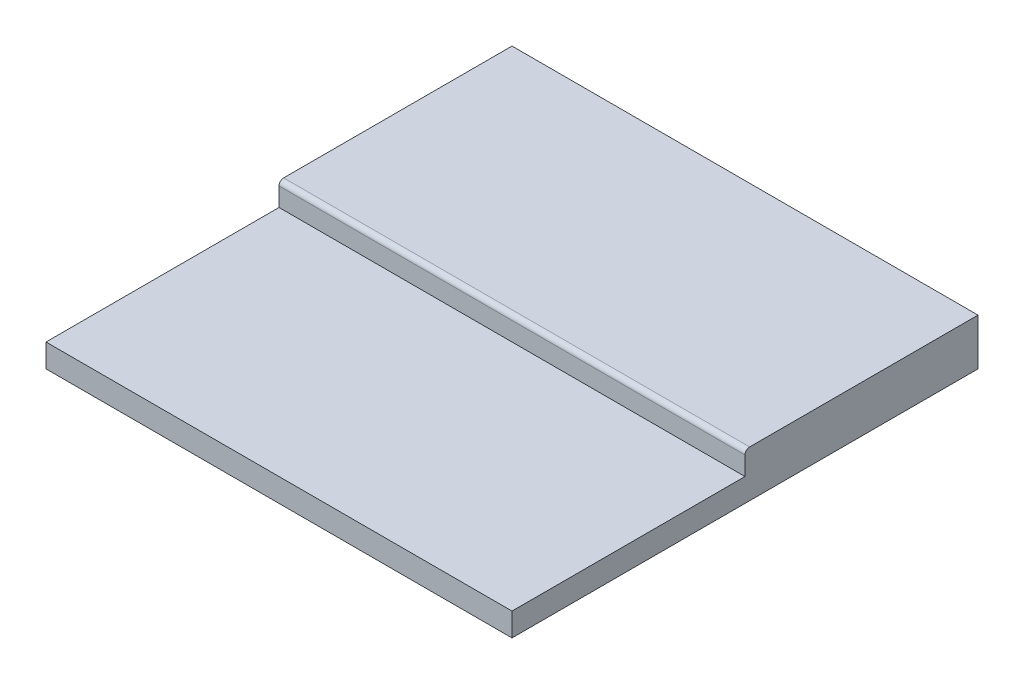
ISO-10303-21;
HEADER;
FILE_DESCRIPTION(('STEP AP214'),'2;1');
FILE_NAME('part.step','',(''),(''),'','','');
FILE_SCHEMA(('AUTOMOTIVE_DESIGN { 1 0 10303 214 1 1 1 1 }'));
ENDSEC;
DATA;
#1=APPLICATION_CONTEXT('core data for automotive mechanical design processes');
#2=APPLICATION_PROTOCOL_DEFINITION('international standard','automotive_design',2000,#1);
#3=PRODUCT_CONTEXT('',#1,'mechanical');
#4=PRODUCT('Part','Part','',(#3));
#5=PRODUCT_RELATED_PRODUCT_CATEGORY('part','',(#4));
#6=PRODUCT_DEFINITION_FORMATION('','',#4);
#7=PRODUCT_DEFINITION_CONTEXT('part definition',#1,'design');
#8=PRODUCT_DEFINITION('design','',#6,#7);
#9=PRODUCT_DEFINITION_SHAPE('','',#8);
#10=(LENGTH_UNIT() NAMED_UNIT(*) SI_UNIT(.MILLI.,.METRE.));
#11=(NAMED_UNIT(*) PLANE_ANGLE_UNIT() SI_UNIT($,.RADIAN.));
#12=(NAMED_UNIT(*) SI_UNIT($,.STERADIAN.) SOLID_ANGLE_UNIT());
#13=UNCERTAINTY_MEASURE_WITH_UNIT(LENGTH_MEASURE(1.E-05),#10,'distance_accuracy_value','');
#14=(GEOMETRIC_REPRESENTATION_CONTEXT(3) GLOBAL_UNCERTAINTY_ASSIGNED_CONTEXT((#13)) GLOBAL_UNIT_ASSIGNED_CONTEXT((#10,
#11,#12)) REPRESENTATION_CONTEXT('',''));
#15=CARTESIAN_POINT('',(0.,0.,0.));
#16=DIRECTION('',(0.,0.,1.));
#17=DIRECTION('',(1.,0.,0.));
#18=AXIS2_PLACEMENT_3D('',#15,#16,#17);
#19=CARTESIAN_POINT('',(0.,100.,0.));
#20=DIRECTION('',(0.,-1.,0.));
#21=DIRECTION('',(0.,0.,-1.));
#22=AXIS2_PLACEMENT_3D('',#19,#20,#21);
#23=PLANE('',#22);
#24=DIRECTION('',(1.,0.,0.));
#25=VECTOR('',#24,1.);
#26=CARTESIAN_POINT('',(1.22464679914735E-13,100.,-1000.));
#27=LINE('',#26,#25);
#28=CARTESIAN_POINT('',(0.,100.,-1000.));
#29=VERTEX_POINT('',#28);
#30=CARTESIAN_POINT('',(2000.,100.,-1000.));
#31=VERTEX_POINT('',#30);
#32=EDGE_CURVE('E119',#29,#31,#27,.T.);
#33=ORIENTED_EDGE('',*,*,#32,.F.);
#34=DIRECTION('',(0.,0.,1.));
#35=VECTOR('',#34,1.);
#36=CARTESIAN_POINT('',(0.,100.,0.));
#37=LINE('',#36,#35);
#38=CARTESIAN_POINT('',(0.,100.,0.));
#39=VERTEX_POINT('',#38);
#40=EDGE_CURVE('E124',#29,#39,#37,.T.);
#41=ORIENTED_EDGE('',*,*,#40,.T.);
#42=DIRECTION('',(1.,0.,0.));
#43=VECTOR('',#42,1.);
#44=CARTESIAN_POINT('',(0.,100.,0.));
#45=LINE('',#44,#43);
#46=CARTESIAN_POINT('',(2000.,100.,0.));
#47=VERTEX_POINT('',#46);
#48=EDGE_CURVE('E126',#39,#47,#45,.T.);
#49=ORIENTED_EDGE('',*,*,#48,.T.);
#50=DIRECTION('',(0.,0.,-1.));
#51=VECTOR('',#50,1.);
#52=CARTESIAN_POINT('',(2000.,100.,0.));
#53=LINE('',#52,#51);
#54=EDGE_CURVE('E129',#47,#31,#53,.T.);
#55=ORIENTED_EDGE('',*,*,#54,.T.);
#56=EDGE_LOOP('',(#33,#41,#49,#55));
#57=FACE_BOUND('',#56,.T.);
#58=ADVANCED_FACE('F32',(#57),#23,.F.);
#59=CARTESIAN_POINT('',(0.,100.,0.));
#60=DIRECTION('',(1.,0.,0.));
#61=DIRECTION('',(0.,0.,-1.));
#62=AXIS2_PLACEMENT_3D('',#59,#60,#61);
#63=PLANE('',#62);
#64=DIRECTION('',(0.,-1.,0.));
#65=VECTOR('',#64,1.);
#66=CARTESIAN_POINT('',(1.22464679914735E-13,200.,-1000.));
#67=LINE('',#66,#65);
#68=CARTESIAN_POINT('',(1.22464679914735E-13,180.,-1000.));
#69=VERTEX_POINT('',#68);
#70=EDGE_CURVE('E115',#69,#29,#67,.T.);
#71=ORIENTED_EDGE('',*,*,#70,.F.);
#72=CARTESIAN_POINT('',(0.,180.,-1020.));
#73=DIRECTION('',(1.,0.,0.));
#74=DIRECTION('',(0.,0.,-1.));
#75=AXIS2_PLACEMENT_3D('',#72,#73,#74);
#76=CIRCLE('',#75,20.);
#77=CARTESIAN_POINT('',(1.20015386316441E-13,200.,-1020.));
#78=VERTEX_POINT('',#77);
#79=EDGE_CURVE('E11',#69,#78,#76,.F.);
#80=ORIENTED_EDGE('',*,*,#79,.T.);
#81=DIRECTION('',(0.,0.,1.));
#82=VECTOR('',#81,1.);
#83=CARTESIAN_POINT('',(0.,200.,-2000.));
#84=LINE('',#83,#82);
#85=CARTESIAN_POINT('',(0.,200.,-2000.));
#86=VERTEX_POINT('',#85);
#87=EDGE_CURVE('E98',#86,#78,#84,.T.);
#88=ORIENTED_EDGE('',*,*,#87,.F.);
#89=DIRECTION('',(0.,-1.,0.));
#90=VECTOR('',#89,1.);
#91=CARTESIAN_POINT('',(0.,100.,-2000.));
#92=LINE('',#91,#90);
#93=CARTESIAN_POINT('',(0.,0.,-2000.));
#94=VERTEX_POINT('',#93);
#95=EDGE_CURVE('E109',#86,#94,#92,.T.);
#96=ORIENTED_EDGE('',*,*,#95,.T.);
#97=DIRECTION('',(0.,0.,1.));
#98=VECTOR('',#97,1.);
#99=CARTESIAN_POINT('',(0.,0.,0.));
#100=LINE('',#99,#98);
#101=CARTESIAN_POINT('',(0.,0.,0.));
#102=VERTEX_POINT('',#101);
#103=EDGE_CURVE('E123',#94,#102,#100,.T.);
#104=ORIENTED_EDGE('',*,*,#103,.T.);
#105=DIRECTION('',(0.,-1.,0.));
#106=VECTOR('',#105,1.);
#107=CARTESIAN_POINT('',(0.,100.,0.));
#108=LINE('',#107,#106);
#109=EDGE_CURVE('E140',#39,#102,#108,.T.);
#110=ORIENTED_EDGE('',*,*,#109,.F.);
#111=ORIENTED_EDGE('',*,*,#40,.F.);
#112=EDGE_LOOP('',(#71,#80,#88,#96,#104,#110,#111));
#113=FACE_BOUND('',#112,.T.);
#114=ADVANCED_FACE('F152',(#113),#63,.F.);
#115=CARTESIAN_POINT('',(0.,100.,0.));
#116=DIRECTION('',(0.,0.,-1.));
#117=DIRECTION('',(-1.,0.,0.));
#118=AXIS2_PLACEMENT_3D('',#115,#116,#117);
#119=PLANE('',#118);
#120=DIRECTION('',(1.,0.,0.));
#121=VECTOR('',#120,1.);
#122=CARTESIAN_POINT('',(0.,0.,0.));
#123=LINE('',#122,#121);
#124=CARTESIAN_POINT('',(2000.,0.,0.));
#125=VERTEX_POINT('',#124);
#126=EDGE_CURVE('E134',#102,#125,#123,.T.);
#127=ORIENTED_EDGE('',*,*,#126,.T.);
#128=DIRECTION('',(0.,-1.,0.));
#129=VECTOR('',#128,1.);
#130=CARTESIAN_POINT('',(2000.,100.,0.));
#131=LINE('',#130,#129);
#132=EDGE_CURVE('E108',#47,#125,#131,.T.);
#133=ORIENTED_EDGE('',*,*,#132,.F.);
#134=ORIENTED_EDGE('',*,*,#48,.F.);
#135=ORIENTED_EDGE('',*,*,#109,.T.);
#136=EDGE_LOOP('',(#127,#133,#134,#135));
#137=FACE_BOUND('',#136,.T.);
#138=ADVANCED_FACE('F147',(#137),#119,.F.);
#139=CARTESIAN_POINT('',(2000.,100.,0.));
#140=DIRECTION('',(-1.,0.,0.));
#141=DIRECTION('',(0.,0.,1.));
#142=AXIS2_PLACEMENT_3D('',#139,#140,#141);
#143=PLANE('',#142);
#144=DIRECTION('',(0.,0.,-1.));
#145=VECTOR('',#144,1.);
#146=CARTESIAN_POINT('',(2000.,200.,-2000.));
#147=LINE('',#146,#145);
#148=CARTESIAN_POINT('',(2000.,200.,-1020.));
#149=VERTEX_POINT('',#148);
#150=CARTESIAN_POINT('',(2000.,200.,-2000.));
#151=VERTEX_POINT('',#150);
#152=EDGE_CURVE('E89',#149,#151,#147,.T.);
#153=ORIENTED_EDGE('',*,*,#152,.F.);
#154=CARTESIAN_POINT('',(2000.,180.,-1020.));
#155=DIRECTION('',(-1.,0.,0.));
#156=DIRECTION('',(0.,0.,1.));
#157=AXIS2_PLACEMENT_3D('',#154,#155,#156);
#158=CIRCLE('',#157,20.);
#159=CARTESIAN_POINT('',(2000.,180.,-1000.));
#160=VERTEX_POINT('',#159);
#161=EDGE_CURVE('E54',#149,#160,#158,.F.);
#162=ORIENTED_EDGE('',*,*,#161,.T.);
#163=DIRECTION('',(0.,-1.,0.));
#164=VECTOR('',#163,1.);
#165=CARTESIAN_POINT('',(2000.,200.,-1000.));
#166=LINE('',#165,#164);
#167=EDGE_CURVE('E113',#160,#31,#166,.T.);
#168=ORIENTED_EDGE('',*,*,#167,.T.);
#169=ORIENTED_EDGE('',*,*,#54,.F.);
#170=ORIENTED_EDGE('',*,*,#132,.T.);
#171=DIRECTION('',(0.,0.,-1.));
#172=VECTOR('',#171,1.);
#173=CARTESIAN_POINT('',(2000.,0.,0.));
#174=LINE('',#173,#172);
#175=CARTESIAN_POINT('',(2000.,0.,-2000.));
#176=VERTEX_POINT('',#175);
#177=EDGE_CURVE('E105',#125,#176,#174,.T.);
#178=ORIENTED_EDGE('',*,*,#177,.T.);
#179=DIRECTION('',(0.,-1.,0.));
#180=VECTOR('',#179,1.);
#181=CARTESIAN_POINT('',(2000.,100.,-2000.));
#182=LINE('',#181,#180);
#183=EDGE_CURVE('E101',#151,#176,#182,.T.);
#184=ORIENTED_EDGE('',*,*,#183,.F.);
#185=EDGE_LOOP('',(#153,#162,#168,#169,#170,#178,#184));
#186=FACE_BOUND('',#185,.T.);
#187=ADVANCED_FACE('F102',(#186),#143,.F.);
#188=CARTESIAN_POINT('',(0.,100.,-2000.));
#189=DIRECTION('',(0.,0.,1.));
#190=DIRECTION('',(1.,0.,0.));
#191=AXIS2_PLACEMENT_3D('',#188,#189,#190);
#192=PLANE('',#191);
#193=DIRECTION('',(-1.,0.,0.));
#194=VECTOR('',#193,1.);
#195=CARTESIAN_POINT('',(0.,0.,-2000.));
#196=LINE('',#195,#194);
#197=EDGE_CURVE('E127',#176,#94,#196,.T.);
#198=ORIENTED_EDGE('',*,*,#197,.T.);
#199=ORIENTED_EDGE('',*,*,#95,.F.);
#200=DIRECTION('',(-1.,0.,0.));
#201=VECTOR('',#200,1.);
#202=CARTESIAN_POINT('',(0.,200.,-2000.));
#203=LINE('',#202,#201);
#204=EDGE_CURVE('E94',#151,#86,#203,.T.);
#205=ORIENTED_EDGE('',*,*,#204,.F.);
#206=ORIENTED_EDGE('',*,*,#183,.T.);
#207=EDGE_LOOP('',(#198,#199,#205,#206));
#208=FACE_BOUND('',#207,.T.);
#209=ADVANCED_FACE('F111',(#208),#192,.F.);
#210=CARTESIAN_POINT('',(0.,0.,0.));
#211=DIRECTION('',(0.,-1.,0.));
#212=DIRECTION('',(0.,0.,-1.));
#213=AXIS2_PLACEMENT_3D('',#210,#211,#212);
#214=PLANE('',#213);
#215=ORIENTED_EDGE('',*,*,#103,.F.);
#216=ORIENTED_EDGE('',*,*,#197,.F.);
#217=ORIENTED_EDGE('',*,*,#177,.F.);
#218=ORIENTED_EDGE('',*,*,#126,.F.);
#219=EDGE_LOOP('',(#215,#216,#217,#218));
#220=FACE_BOUND('',#219,.T.);
#221=ADVANCED_FACE('F154',(#220),#214,.T.);
#222=CARTESIAN_POINT('',(1.22464679914735E-13,200.,-1000.));
#223=DIRECTION('',(0.,0.,-1.));
#224=DIRECTION('',(-1.,0.,0.));
#225=AXIS2_PLACEMENT_3D('',#222,#223,#224);
#226=PLANE('',#225);
#227=ORIENTED_EDGE('',*,*,#167,.F.);
#228=DIRECTION('',(1.,0.,0.));
#229=VECTOR('',#228,1.);
#230=CARTESIAN_POINT('',(1.22464679914735E-13,180.,-1000.));
#231=LINE('',#230,#229);
#232=EDGE_CURVE('E40',#160,#69,#231,.F.);
#233=ORIENTED_EDGE('',*,*,#232,.T.);
#234=ORIENTED_EDGE('',*,*,#70,.T.);
#235=ORIENTED_EDGE('',*,*,#32,.T.);
#236=EDGE_LOOP('',(#227,#233,#234,#235));
#237=FACE_BOUND('',#236,.T.);
#238=ADVANCED_FACE('F156',(#237),#226,.F.);
#239=CARTESIAN_POINT('',(0.,200.,0.));
#240=DIRECTION('',(0.,1.,0.));
#241=DIRECTION('',(0.,0.,1.));
#242=AXIS2_PLACEMENT_3D('',#239,#240,#241);
#243=PLANE('',#242);
#244=ORIENTED_EDGE('',*,*,#87,.T.);
#245=DIRECTION('',(1.,0.,0.));
#246=VECTOR('',#245,1.);
#247=CARTESIAN_POINT('',(2000.,200.,-1020.));
#248=LINE('',#247,#246);
#249=EDGE_CURVE('E97',#78,#149,#248,.T.);
#250=ORIENTED_EDGE('',*,*,#249,.T.);
#251=ORIENTED_EDGE('',*,*,#152,.T.);
#252=ORIENTED_EDGE('',*,*,#204,.T.);
#253=EDGE_LOOP('',(#244,#250,#251,#252));
#254=FACE_BOUND('',#253,.T.);
#255=ADVANCED_FACE('F92',(#254),#243,.T.);
#256=CARTESIAN_POINT('',(0.,180.,-1020.));
#257=DIRECTION('',(-1.,0.,0.));
#258=DIRECTION('',(0.,0.,1.));
#259=AXIS2_PLACEMENT_3D('',#256,#257,#258);
#260=CYLINDRICAL_SURFACE('',#259,20.);
#261=ORIENTED_EDGE('',*,*,#79,.F.);
#262=ORIENTED_EDGE('',*,*,#232,.F.);
#263=ORIENTED_EDGE('',*,*,#161,.F.);
#264=ORIENTED_EDGE('',*,*,#249,.F.);
#265=EDGE_LOOP('',(#261,#262,#263,#264));
#266=FACE_BOUND('',#265,.T.);
#267=ADVANCED_FACE('F34',(#266),#260,.T.);
#268=CLOSED_SHELL('',(#58,#114,#138,#187,#209,#221,#238,#255,#267));
#269=MANIFOLD_SOLID_BREP('B2',#268);
#270=ADVANCED_BREP_SHAPE_REPRESENTATION('',(#18,#269),#14);
#271=SHAPE_DEFINITION_REPRESENTATION(#9,#270);
ENDSEC;
END-ISO-10303-21;
